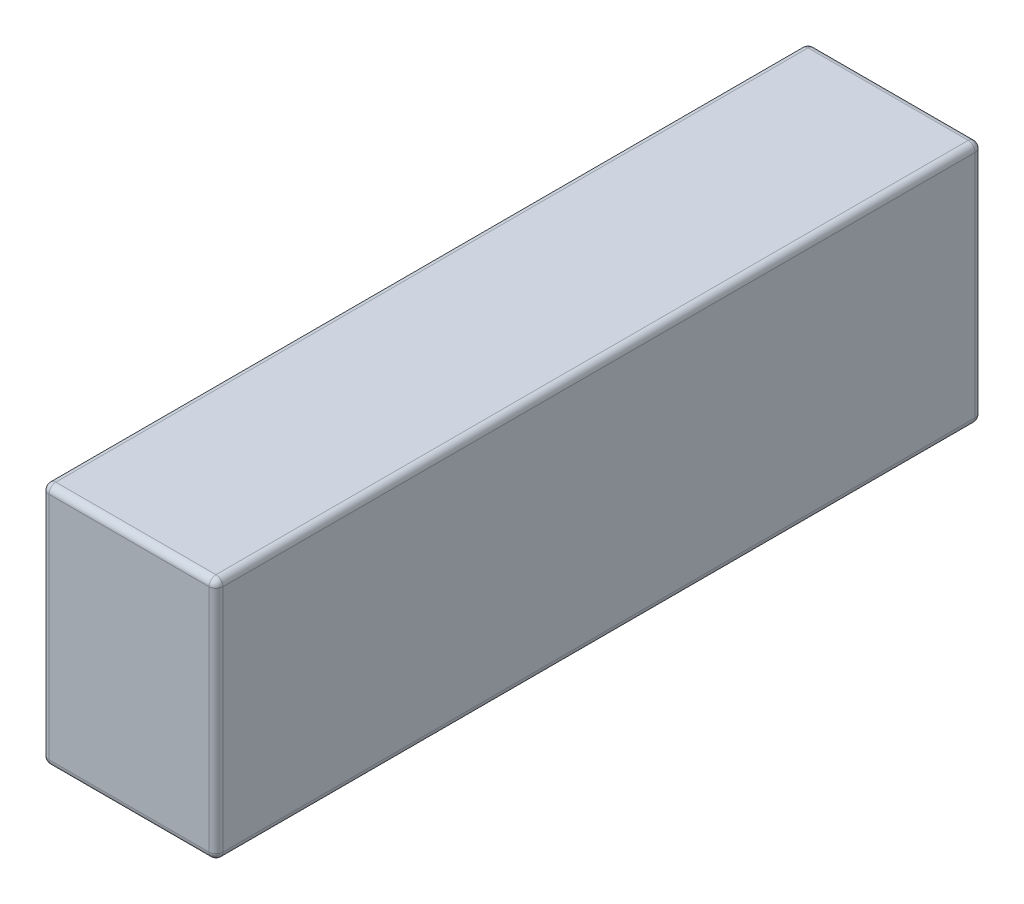
ISO-10303-21;
HEADER;
FILE_DESCRIPTION(('STEP AP214'),'2;1');
FILE_NAME('part.step','',(''),(''),'','','');
FILE_SCHEMA(('AUTOMOTIVE_DESIGN { 1 0 10303 214 1 1 1 1 }'));
ENDSEC;
DATA;
#1=APPLICATION_CONTEXT('core data for automotive mechanical design processes');
#2=APPLICATION_PROTOCOL_DEFINITION('international standard','automotive_design',2000,#1);
#3=PRODUCT_CONTEXT('',#1,'mechanical');
#4=PRODUCT('Part','Part','',(#3));
#5=PRODUCT_RELATED_PRODUCT_CATEGORY('part','',(#4));
#6=PRODUCT_DEFINITION_FORMATION('','',#4);
#7=PRODUCT_DEFINITION_CONTEXT('part definition',#1,'design');
#8=PRODUCT_DEFINITION('design','',#6,#7);
#9=PRODUCT_DEFINITION_SHAPE('','',#8);
#10=(LENGTH_UNIT() NAMED_UNIT(*) SI_UNIT(.MILLI.,.METRE.));
#11=(NAMED_UNIT(*) PLANE_ANGLE_UNIT() SI_UNIT($,.RADIAN.));
#12=(NAMED_UNIT(*) SI_UNIT($,.STERADIAN.) SOLID_ANGLE_UNIT());
#13=UNCERTAINTY_MEASURE_WITH_UNIT(LENGTH_MEASURE(1.E-05),#10,'distance_accuracy_value','');
#14=(GEOMETRIC_REPRESENTATION_CONTEXT(3) GLOBAL_UNCERTAINTY_ASSIGNED_CONTEXT((#13)) GLOBAL_UNIT_ASSIGNED_CONTEXT((#10,
#11,#12)) REPRESENTATION_CONTEXT('',''));
#15=CARTESIAN_POINT('',(0.,0.,0.));
#16=DIRECTION('',(0.,0.,1.));
#17=DIRECTION('',(1.,0.,0.));
#18=AXIS2_PLACEMENT_3D('',#15,#16,#17);
#19=CARTESIAN_POINT('',(-12.5,35.,55.));
#20=DIRECTION('',(1.,0.,0.));
#21=DIRECTION('',(0.,0.,-1.));
#22=AXIS2_PLACEMENT_3D('',#19,#20,#21);
#23=PLANE('',#22);
#24=DIRECTION('',(0.,0.,1.));
#25=VECTOR('',#24,1.);
#26=CARTESIAN_POINT('',(-12.5,34.,-55.));
#27=LINE('',#26,#25);
#28=CARTESIAN_POINT('',(-12.5,34.,54.));
#29=VERTEX_POINT('',#28);
#30=CARTESIAN_POINT('',(-12.5,34.,-54.));
#31=VERTEX_POINT('',#30);
#32=EDGE_CURVE('E174',#29,#31,#27,.F.);
#33=ORIENTED_EDGE('',*,*,#32,.T.);
#34=DIRECTION('',(0.,-1.,0.));
#35=VECTOR('',#34,1.);
#36=CARTESIAN_POINT('',(-12.5,35.,-54.));
#37=LINE('',#36,#35);
#38=CARTESIAN_POINT('',(-12.5,1.,-54.));
#39=VERTEX_POINT('',#38);
#40=EDGE_CURVE('E180',#31,#39,#37,.T.);
#41=ORIENTED_EDGE('',*,*,#40,.T.);
#42=DIRECTION('',(0.,0.,1.));
#43=VECTOR('',#42,1.);
#44=CARTESIAN_POINT('',(-12.5,1.,55.));
#45=LINE('',#44,#43);
#46=CARTESIAN_POINT('',(-12.5,1.,54.));
#47=VERTEX_POINT('',#46);
#48=EDGE_CURVE('E178',#39,#47,#45,.T.);
#49=ORIENTED_EDGE('',*,*,#48,.T.);
#50=DIRECTION('',(0.,-1.,0.));
#51=VECTOR('',#50,1.);
#52=CARTESIAN_POINT('',(-12.5,35.,54.));
#53=LINE('',#52,#51);
#54=EDGE_CURVE('E176',#47,#29,#53,.F.);
#55=ORIENTED_EDGE('',*,*,#54,.T.);
#56=EDGE_LOOP('',(#33,#41,#49,#55));
#57=FACE_BOUND('',#56,.T.);
#58=ADVANCED_FACE('F34',(#57),#23,.F.);
#59=CARTESIAN_POINT('',(12.5,35.,55.));
#60=DIRECTION('',(0.,0.,-1.));
#61=DIRECTION('',(-1.,0.,0.));
#62=AXIS2_PLACEMENT_3D('',#59,#60,#61);
#63=PLANE('',#62);
#64=DIRECTION('',(1.,0.,0.));
#65=VECTOR('',#64,1.);
#66=CARTESIAN_POINT('',(-12.5,34.,55.));
#67=LINE('',#66,#65);
#68=CARTESIAN_POINT('',(11.5,34.,55.));
#69=VERTEX_POINT('',#68);
#70=CARTESIAN_POINT('',(-11.5,34.,55.));
#71=VERTEX_POINT('',#70);
#72=EDGE_CURVE('E185',#69,#71,#67,.F.);
#73=ORIENTED_EDGE('',*,*,#72,.T.);
#74=DIRECTION('',(0.,-1.,0.));
#75=VECTOR('',#74,1.);
#76=CARTESIAN_POINT('',(-11.5,35.,55.));
#77=LINE('',#76,#75);
#78=CARTESIAN_POINT('',(-11.5,1.,55.));
#79=VERTEX_POINT('',#78);
#80=EDGE_CURVE('E189',#71,#79,#77,.T.);
#81=ORIENTED_EDGE('',*,*,#80,.T.);
#82=DIRECTION('',(1.,0.,0.));
#83=VECTOR('',#82,1.);
#84=CARTESIAN_POINT('',(12.5,1.,55.));
#85=LINE('',#84,#83);
#86=CARTESIAN_POINT('',(11.5,1.,55.));
#87=VERTEX_POINT('',#86);
#88=EDGE_CURVE('E187',#79,#87,#85,.T.);
#89=ORIENTED_EDGE('',*,*,#88,.T.);
#90=DIRECTION('',(0.,-1.,0.));
#91=VECTOR('',#90,1.);
#92=CARTESIAN_POINT('',(11.5,35.,55.));
#93=LINE('',#92,#91);
#94=EDGE_CURVE('E183',#87,#69,#93,.F.);
#95=ORIENTED_EDGE('',*,*,#94,.T.);
#96=EDGE_LOOP('',(#73,#81,#89,#95));
#97=FACE_BOUND('',#96,.T.);
#98=ADVANCED_FACE('F273',(#97),#63,.F.);
#99=CARTESIAN_POINT('',(12.5,35.,55.));
#100=DIRECTION('',(-1.,0.,0.));
#101=DIRECTION('',(0.,0.,1.));
#102=AXIS2_PLACEMENT_3D('',#99,#100,#101);
#103=PLANE('',#102);
#104=DIRECTION('',(0.,0.,-1.));
#105=VECTOR('',#104,1.);
#106=CARTESIAN_POINT('',(12.5,34.,55.));
#107=LINE('',#106,#105);
#108=CARTESIAN_POINT('',(12.5,34.,-54.));
#109=VERTEX_POINT('',#108);
#110=CARTESIAN_POINT('',(12.5,34.,54.));
#111=VERTEX_POINT('',#110);
#112=EDGE_CURVE('E43',#109,#111,#107,.F.);
#113=ORIENTED_EDGE('',*,*,#112,.T.);
#114=DIRECTION('',(0.,-1.,0.));
#115=VECTOR('',#114,1.);
#116=CARTESIAN_POINT('',(12.5,35.,54.));
#117=LINE('',#116,#115);
#118=CARTESIAN_POINT('',(12.5,1.,54.));
#119=VERTEX_POINT('',#118);
#120=EDGE_CURVE('E11',#111,#119,#117,.T.);
#121=ORIENTED_EDGE('',*,*,#120,.T.);
#122=DIRECTION('',(0.,0.,-1.));
#123=VECTOR('',#122,1.);
#124=CARTESIAN_POINT('',(12.5,1.,55.));
#125=LINE('',#124,#123);
#126=CARTESIAN_POINT('',(12.5,1.,-54.));
#127=VERTEX_POINT('',#126);
#128=EDGE_CURVE('E199',#119,#127,#125,.T.);
#129=ORIENTED_EDGE('',*,*,#128,.T.);
#130=DIRECTION('',(0.,-1.,0.));
#131=VECTOR('',#130,1.);
#132=CARTESIAN_POINT('',(12.5,35.,-54.));
#133=LINE('',#132,#131);
#134=EDGE_CURVE('E54',#127,#109,#133,.F.);
#135=ORIENTED_EDGE('',*,*,#134,.T.);
#136=EDGE_LOOP('',(#113,#121,#129,#135));
#137=FACE_BOUND('',#136,.T.);
#138=ADVANCED_FACE('F286',(#137),#103,.F.);
#139=CARTESIAN_POINT('',(12.5,35.,-55.));
#140=DIRECTION('',(0.,0.,1.));
#141=DIRECTION('',(1.,0.,0.));
#142=AXIS2_PLACEMENT_3D('',#139,#140,#141);
#143=PLANE('',#142);
#144=DIRECTION('',(0.,-1.,0.));
#145=VECTOR('',#144,1.);
#146=CARTESIAN_POINT('',(11.5,35.,-55.));
#147=LINE('',#146,#145);
#148=CARTESIAN_POINT('',(11.5,34.,-55.));
#149=VERTEX_POINT('',#148);
#150=CARTESIAN_POINT('',(11.5,1.,-55.));
#151=VERTEX_POINT('',#150);
#152=EDGE_CURVE('E126',#149,#151,#147,.T.);
#153=ORIENTED_EDGE('',*,*,#152,.T.);
#154=DIRECTION('',(-1.,0.,0.));
#155=VECTOR('',#154,1.);
#156=CARTESIAN_POINT('',(12.5,1.,-55.));
#157=LINE('',#156,#155);
#158=CARTESIAN_POINT('',(-11.5,1.,-55.));
#159=VERTEX_POINT('',#158);
#160=EDGE_CURVE('E163',#151,#159,#157,.T.);
#161=ORIENTED_EDGE('',*,*,#160,.T.);
#162=DIRECTION('',(0.,-1.,0.));
#163=VECTOR('',#162,1.);
#164=CARTESIAN_POINT('',(-11.5,35.,-55.));
#165=LINE('',#164,#163);
#166=CARTESIAN_POINT('',(-11.5,34.,-55.));
#167=VERTEX_POINT('',#166);
#168=EDGE_CURVE('E129',#159,#167,#165,.F.);
#169=ORIENTED_EDGE('',*,*,#168,.T.);
#170=DIRECTION('',(-1.,0.,0.));
#171=VECTOR('',#170,1.);
#172=CARTESIAN_POINT('',(12.5,34.,-55.));
#173=LINE('',#172,#171);
#174=EDGE_CURVE('E121',#167,#149,#173,.F.);
#175=ORIENTED_EDGE('',*,*,#174,.T.);
#176=EDGE_LOOP('',(#153,#161,#169,#175));
#177=FACE_BOUND('',#176,.T.);
#178=ADVANCED_FACE('F123',(#177),#143,.F.);
#179=CARTESIAN_POINT('',(0.,35.,0.));
#180=DIRECTION('',(0.,1.,0.));
#181=DIRECTION('',(0.,0.,1.));
#182=AXIS2_PLACEMENT_3D('',#179,#180,#181);
#183=PLANE('',#182);
#184=DIRECTION('',(-1.,0.,0.));
#185=VECTOR('',#184,1.);
#186=CARTESIAN_POINT('',(-12.5,35.,-54.));
#187=LINE('',#186,#185);
#188=CARTESIAN_POINT('',(11.5,35.,-54.));
#189=VERTEX_POINT('',#188);
#190=CARTESIAN_POINT('',(-11.5,35.,-54.));
#191=VERTEX_POINT('',#190);
#192=EDGE_CURVE('E140',#189,#191,#187,.T.);
#193=ORIENTED_EDGE('',*,*,#192,.T.);
#194=DIRECTION('',(0.,0.,1.));
#195=VECTOR('',#194,1.);
#196=CARTESIAN_POINT('',(-11.5,35.,55.));
#197=LINE('',#196,#195);
#198=CARTESIAN_POINT('',(-11.5,35.,54.));
#199=VERTEX_POINT('',#198);
#200=EDGE_CURVE('E197',#191,#199,#197,.T.);
#201=ORIENTED_EDGE('',*,*,#200,.T.);
#202=DIRECTION('',(1.,0.,0.));
#203=VECTOR('',#202,1.);
#204=CARTESIAN_POINT('',(12.5,35.,54.));
#205=LINE('',#204,#203);
#206=CARTESIAN_POINT('',(11.5,35.,54.));
#207=VERTEX_POINT('',#206);
#208=EDGE_CURVE('E194',#199,#207,#205,.T.);
#209=ORIENTED_EDGE('',*,*,#208,.T.);
#210=DIRECTION('',(0.,0.,-1.));
#211=VECTOR('',#210,1.);
#212=CARTESIAN_POINT('',(11.5,35.,-55.));
#213=LINE('',#212,#211);
#214=EDGE_CURVE('E192',#207,#189,#213,.T.);
#215=ORIENTED_EDGE('',*,*,#214,.T.);
#216=EDGE_LOOP('',(#193,#201,#209,#215));
#217=FACE_BOUND('',#216,.T.);
#218=ADVANCED_FACE('F478',(#217),#183,.T.);
#219=CARTESIAN_POINT('',(0.,0.,0.));
#220=DIRECTION('',(0.,1.,0.));
#221=DIRECTION('',(0.,0.,1.));
#222=AXIS2_PLACEMENT_3D('',#219,#220,#221);
#223=PLANE('',#222);
#224=DIRECTION('',(0.,0.,1.));
#225=VECTOR('',#224,1.);
#226=CARTESIAN_POINT('',(-11.5,0.,0.));
#227=LINE('',#226,#225);
#228=CARTESIAN_POINT('',(-11.5,0.,54.));
#229=VERTEX_POINT('',#228);
#230=CARTESIAN_POINT('',(-11.5,0.,-54.));
#231=VERTEX_POINT('',#230);
#232=EDGE_CURVE('E169',#229,#231,#227,.F.);
#233=ORIENTED_EDGE('',*,*,#232,.T.);
#234=DIRECTION('',(-1.,0.,0.));
#235=VECTOR('',#234,1.);
#236=CARTESIAN_POINT('',(0.,0.,-54.));
#237=LINE('',#236,#235);
#238=CARTESIAN_POINT('',(11.5,0.,-54.));
#239=VERTEX_POINT('',#238);
#240=EDGE_CURVE('E171',#231,#239,#237,.F.);
#241=ORIENTED_EDGE('',*,*,#240,.T.);
#242=DIRECTION('',(0.,0.,-1.));
#243=VECTOR('',#242,1.);
#244=CARTESIAN_POINT('',(11.5,0.,0.));
#245=LINE('',#244,#243);
#246=CARTESIAN_POINT('',(11.5,0.,54.));
#247=VERTEX_POINT('',#246);
#248=EDGE_CURVE('E165',#239,#247,#245,.F.);
#249=ORIENTED_EDGE('',*,*,#248,.T.);
#250=DIRECTION('',(1.,0.,0.));
#251=VECTOR('',#250,1.);
#252=CARTESIAN_POINT('',(0.,0.,54.));
#253=LINE('',#252,#251);
#254=EDGE_CURVE('E167',#247,#229,#253,.F.);
#255=ORIENTED_EDGE('',*,*,#254,.T.);
#256=EDGE_LOOP('',(#233,#241,#249,#255));
#257=FACE_BOUND('',#256,.T.);
#258=ADVANCED_FACE('F471',(#257),#223,.F.);
#259=CARTESIAN_POINT('',(0.,34.,54.));
#260=DIRECTION('',(-1.,0.,0.));
#261=DIRECTION('',(0.,0.,1.));
#262=AXIS2_PLACEMENT_3D('',#259,#260,#261);
#263=CYLINDRICAL_SURFACE('',#262,1.);
#264=CARTESIAN_POINT('',(11.5,34.,54.));
#265=DIRECTION('',(1.,0.,0.));
#266=DIRECTION('',(0.,0.,-1.));
#267=AXIS2_PLACEMENT_3D('',#264,#265,#266);
#268=CIRCLE('',#267,1.);
#269=EDGE_CURVE('E38',#207,#69,#268,.T.);
#270=ORIENTED_EDGE('',*,*,#269,.F.);
#271=ORIENTED_EDGE('',*,*,#208,.F.);
#272=CARTESIAN_POINT('',(-11.5,34.,54.));
#273=DIRECTION('',(-1.,0.,0.));
#274=DIRECTION('',(0.,0.,1.));
#275=AXIS2_PLACEMENT_3D('',#272,#273,#274);
#276=CIRCLE('',#275,1.);
#277=EDGE_CURVE('E160',#71,#199,#276,.T.);
#278=ORIENTED_EDGE('',*,*,#277,.F.);
#279=ORIENTED_EDGE('',*,*,#72,.F.);
#280=EDGE_LOOP('',(#270,#271,#278,#279));
#281=FACE_BOUND('',#280,.T.);
#282=ADVANCED_FACE('F36',(#281),#263,.T.);
#283=CARTESIAN_POINT('',(11.5,34.,54.));
#284=DIRECTION('',(0.,0.,1.));
#285=DIRECTION('',(1.,0.,0.));
#286=AXIS2_PLACEMENT_3D('',#283,#284,#285);
#287=SPHERICAL_SURFACE('',#286,1.);
#288=CARTESIAN_POINT('',(11.5,34.,54.));
#289=DIRECTION('',(0.,0.,1.));
#290=DIRECTION('',(1.,0.,0.));
#291=AXIS2_PLACEMENT_3D('',#288,#289,#290);
#292=CIRCLE('',#291,1.);
#293=EDGE_CURVE('E244',#207,#111,#292,.F.);
#294=ORIENTED_EDGE('',*,*,#293,.F.);
#295=ORIENTED_EDGE('',*,*,#269,.T.);
#296=CARTESIAN_POINT('',(11.5,34.,54.));
#297=DIRECTION('',(0.,1.,0.));
#298=DIRECTION('',(0.,0.,1.));
#299=AXIS2_PLACEMENT_3D('',#296,#297,#298);
#300=CIRCLE('',#299,1.);
#301=EDGE_CURVE('E246',#111,#69,#300,.F.);
#302=ORIENTED_EDGE('',*,*,#301,.F.);
#303=EDGE_LOOP('',(#294,#295,#302));
#304=FACE_BOUND('',#303,.T.);
#305=ADVANCED_FACE('F279',(#304),#287,.T.);
#306=CARTESIAN_POINT('',(-11.5,34.,54.));
#307=DIRECTION('',(0.,0.,1.));
#308=DIRECTION('',(1.,0.,0.));
#309=AXIS2_PLACEMENT_3D('',#306,#307,#308);
#310=SPHERICAL_SURFACE('',#309,1.);
#311=CARTESIAN_POINT('',(-11.5,34.,54.));
#312=DIRECTION('',(0.,1.,0.));
#313=DIRECTION('',(0.,0.,1.));
#314=AXIS2_PLACEMENT_3D('',#311,#312,#313);
#315=CIRCLE('',#314,1.);
#316=EDGE_CURVE('E238',#71,#29,#315,.F.);
#317=ORIENTED_EDGE('',*,*,#316,.F.);
#318=ORIENTED_EDGE('',*,*,#277,.T.);
#319=CARTESIAN_POINT('',(-11.5,34.,54.));
#320=DIRECTION('',(0.,0.,1.));
#321=DIRECTION('',(1.,0.,0.));
#322=AXIS2_PLACEMENT_3D('',#319,#320,#321);
#323=CIRCLE('',#322,1.);
#324=EDGE_CURVE('E241',#29,#199,#323,.F.);
#325=ORIENTED_EDGE('',*,*,#324,.F.);
#326=EDGE_LOOP('',(#317,#318,#325));
#327=FACE_BOUND('',#326,.T.);
#328=ADVANCED_FACE('F253',(#327),#310,.T.);
#329=CARTESIAN_POINT('',(11.5,35.,54.));
#330=DIRECTION('',(0.,-1.,0.));
#331=DIRECTION('',(0.,0.,-1.));
#332=AXIS2_PLACEMENT_3D('',#329,#330,#331);
#333=CYLINDRICAL_SURFACE('',#332,1.);
#334=ORIENTED_EDGE('',*,*,#301,.T.);
#335=ORIENTED_EDGE('',*,*,#94,.F.);
#336=CARTESIAN_POINT('',(11.5,1.,54.));
#337=DIRECTION('',(0.,-1.,0.));
#338=DIRECTION('',(0.,0.,-1.));
#339=AXIS2_PLACEMENT_3D('',#336,#337,#338);
#340=CIRCLE('',#339,1.);
#341=EDGE_CURVE('E232',#119,#87,#340,.T.);
#342=ORIENTED_EDGE('',*,*,#341,.F.);
#343=ORIENTED_EDGE('',*,*,#120,.F.);
#344=EDGE_LOOP('',(#334,#335,#342,#343));
#345=FACE_BOUND('',#344,.T.);
#346=ADVANCED_FACE('F283',(#345),#333,.T.);
#347=CARTESIAN_POINT('',(11.5,34.,0.));
#348=DIRECTION('',(0.,0.,1.));
#349=DIRECTION('',(1.,0.,0.));
#350=AXIS2_PLACEMENT_3D('',#347,#348,#349);
#351=CYLINDRICAL_SURFACE('',#350,1.);
#352=ORIENTED_EDGE('',*,*,#293,.T.);
#353=ORIENTED_EDGE('',*,*,#112,.F.);
#354=CARTESIAN_POINT('',(11.5,34.,-54.));
#355=DIRECTION('',(0.,0.,-1.));
#356=DIRECTION('',(-1.,0.,0.));
#357=AXIS2_PLACEMENT_3D('',#354,#355,#356);
#358=CIRCLE('',#357,1.);
#359=EDGE_CURVE('E144',#189,#109,#358,.T.);
#360=ORIENTED_EDGE('',*,*,#359,.F.);
#361=ORIENTED_EDGE('',*,*,#214,.F.);
#362=EDGE_LOOP('',(#352,#353,#360,#361));
#363=FACE_BOUND('',#362,.T.);
#364=ADVANCED_FACE('F435',(#363),#351,.T.);
#365=CARTESIAN_POINT('',(0.,34.,-54.));
#366=DIRECTION('',(1.,0.,0.));
#367=DIRECTION('',(0.,0.,-1.));
#368=AXIS2_PLACEMENT_3D('',#365,#366,#367);
#369=CYLINDRICAL_SURFACE('',#368,1.);
#370=CARTESIAN_POINT('',(-11.5,34.,-54.));
#371=DIRECTION('',(-1.,0.,0.));
#372=DIRECTION('',(0.,0.,1.));
#373=AXIS2_PLACEMENT_3D('',#370,#371,#372);
#374=CIRCLE('',#373,1.);
#375=EDGE_CURVE('E145',#191,#167,#374,.T.);
#376=ORIENTED_EDGE('',*,*,#375,.F.);
#377=ORIENTED_EDGE('',*,*,#192,.F.);
#378=CARTESIAN_POINT('',(11.5,34.,-54.));
#379=DIRECTION('',(1.,0.,0.));
#380=DIRECTION('',(0.,0.,-1.));
#381=AXIS2_PLACEMENT_3D('',#378,#379,#380);
#382=CIRCLE('',#381,1.);
#383=EDGE_CURVE('E136',#149,#189,#382,.T.);
#384=ORIENTED_EDGE('',*,*,#383,.F.);
#385=ORIENTED_EDGE('',*,*,#174,.F.);
#386=EDGE_LOOP('',(#376,#377,#384,#385));
#387=FACE_BOUND('',#386,.T.);
#388=ADVANCED_FACE('F138',(#387),#369,.T.);
#389=CARTESIAN_POINT('',(-11.5,34.,0.));
#390=DIRECTION('',(0.,0.,-1.));
#391=DIRECTION('',(-1.,0.,0.));
#392=AXIS2_PLACEMENT_3D('',#389,#390,#391);
#393=CYLINDRICAL_SURFACE('',#392,1.);
#394=ORIENTED_EDGE('',*,*,#324,.T.);
#395=ORIENTED_EDGE('',*,*,#200,.F.);
#396=CARTESIAN_POINT('',(-11.5,34.,-54.));
#397=DIRECTION('',(0.,0.,-1.));
#398=DIRECTION('',(-1.,0.,0.));
#399=AXIS2_PLACEMENT_3D('',#396,#397,#398);
#400=CIRCLE('',#399,1.);
#401=EDGE_CURVE('E228',#31,#191,#400,.T.);
#402=ORIENTED_EDGE('',*,*,#401,.F.);
#403=ORIENTED_EDGE('',*,*,#32,.F.);
#404=EDGE_LOOP('',(#394,#395,#402,#403));
#405=FACE_BOUND('',#404,.T.);
#406=ADVANCED_FACE('F261',(#405),#393,.T.);
#407=CARTESIAN_POINT('',(-11.5,35.,54.));
#408=DIRECTION('',(0.,-1.,0.));
#409=DIRECTION('',(0.,0.,-1.));
#410=AXIS2_PLACEMENT_3D('',#407,#408,#409);
#411=CYLINDRICAL_SURFACE('',#410,1.);
#412=ORIENTED_EDGE('',*,*,#316,.T.);
#413=ORIENTED_EDGE('',*,*,#54,.F.);
#414=CARTESIAN_POINT('',(-11.5,1.,54.));
#415=DIRECTION('',(0.,-1.,0.));
#416=DIRECTION('',(0.,0.,-1.));
#417=AXIS2_PLACEMENT_3D('',#414,#415,#416);
#418=CIRCLE('',#417,1.);
#419=EDGE_CURVE('E225',#79,#47,#418,.T.);
#420=ORIENTED_EDGE('',*,*,#419,.F.);
#421=ORIENTED_EDGE('',*,*,#80,.F.);
#422=EDGE_LOOP('',(#412,#413,#420,#421));
#423=FACE_BOUND('',#422,.T.);
#424=ADVANCED_FACE('F270',(#423),#411,.T.);
#425=CARTESIAN_POINT('',(12.5,1.,54.));
#426=DIRECTION('',(1.,0.,0.));
#427=DIRECTION('',(0.,0.,-1.));
#428=AXIS2_PLACEMENT_3D('',#425,#426,#427);
#429=CYLINDRICAL_SURFACE('',#428,1.);
#430=CARTESIAN_POINT('',(11.5,1.,54.));
#431=DIRECTION('',(1.,0.,0.));
#432=DIRECTION('',(0.,0.,-1.));
#433=AXIS2_PLACEMENT_3D('',#430,#431,#432);
#434=CIRCLE('',#433,1.);
#435=EDGE_CURVE('E235',#87,#247,#434,.T.);
#436=ORIENTED_EDGE('',*,*,#435,.F.);
#437=ORIENTED_EDGE('',*,*,#88,.F.);
#438=CARTESIAN_POINT('',(-11.5,1.,54.));
#439=DIRECTION('',(-1.,0.,0.));
#440=DIRECTION('',(0.,0.,1.));
#441=AXIS2_PLACEMENT_3D('',#438,#439,#440);
#442=CIRCLE('',#441,1.);
#443=EDGE_CURVE('E223',#229,#79,#442,.T.);
#444=ORIENTED_EDGE('',*,*,#443,.F.);
#445=ORIENTED_EDGE('',*,*,#254,.F.);
#446=EDGE_LOOP('',(#436,#437,#444,#445));
#447=FACE_BOUND('',#446,.T.);
#448=ADVANCED_FACE('F404',(#447),#429,.T.);
#449=CARTESIAN_POINT('',(11.5,1.,54.));
#450=DIRECTION('',(0.,0.,1.));
#451=DIRECTION('',(1.,0.,0.));
#452=AXIS2_PLACEMENT_3D('',#449,#450,#451);
#453=SPHERICAL_SURFACE('',#452,1.);
#454=ORIENTED_EDGE('',*,*,#341,.T.);
#455=ORIENTED_EDGE('',*,*,#435,.T.);
#456=CARTESIAN_POINT('',(11.5,1.,54.));
#457=DIRECTION('',(0.,0.,1.));
#458=DIRECTION('',(1.,0.,0.));
#459=AXIS2_PLACEMENT_3D('',#456,#457,#458);
#460=CIRCLE('',#459,1.);
#461=EDGE_CURVE('E151',#119,#247,#460,.F.);
#462=ORIENTED_EDGE('',*,*,#461,.F.);
#463=EDGE_LOOP('',(#454,#455,#462));
#464=FACE_BOUND('',#463,.T.);
#465=ADVANCED_FACE('F316',(#464),#453,.T.);
#466=CARTESIAN_POINT('',(11.5,34.,-54.));
#467=DIRECTION('',(0.,0.,1.));
#468=DIRECTION('',(1.,0.,0.));
#469=AXIS2_PLACEMENT_3D('',#466,#467,#468);
#470=SPHERICAL_SURFACE('',#469,1.);
#471=ORIENTED_EDGE('',*,*,#383,.T.);
#472=ORIENTED_EDGE('',*,*,#359,.T.);
#473=CARTESIAN_POINT('',(11.5,34.,-54.));
#474=DIRECTION('',(0.,1.,0.));
#475=DIRECTION('',(0.,0.,1.));
#476=AXIS2_PLACEMENT_3D('',#473,#474,#475);
#477=CIRCLE('',#476,1.);
#478=EDGE_CURVE('E148',#149,#109,#477,.F.);
#479=ORIENTED_EDGE('',*,*,#478,.F.);
#480=EDGE_LOOP('',(#471,#472,#479));
#481=FACE_BOUND('',#480,.T.);
#482=ADVANCED_FACE('F149',(#481),#470,.T.);
#483=CARTESIAN_POINT('',(-11.5,34.,-54.));
#484=DIRECTION('',(0.,0.,1.));
#485=DIRECTION('',(1.,0.,0.));
#486=AXIS2_PLACEMENT_3D('',#483,#484,#485);
#487=SPHERICAL_SURFACE('',#486,1.);
#488=ORIENTED_EDGE('',*,*,#401,.T.);
#489=ORIENTED_EDGE('',*,*,#375,.T.);
#490=CARTESIAN_POINT('',(-11.5,34.,-54.));
#491=DIRECTION('',(0.,1.,0.));
#492=DIRECTION('',(0.,0.,1.));
#493=AXIS2_PLACEMENT_3D('',#490,#491,#492);
#494=CIRCLE('',#493,1.);
#495=EDGE_CURVE('E152',#31,#167,#494,.F.);
#496=ORIENTED_EDGE('',*,*,#495,.F.);
#497=EDGE_LOOP('',(#488,#489,#496));
#498=FACE_BOUND('',#497,.T.);
#499=ADVANCED_FACE('F306',(#498),#487,.T.);
#500=CARTESIAN_POINT('',(-11.5,1.,54.));
#501=DIRECTION('',(0.,0.,1.));
#502=DIRECTION('',(1.,0.,0.));
#503=AXIS2_PLACEMENT_3D('',#500,#501,#502);
#504=SPHERICAL_SURFACE('',#503,1.);
#505=ORIENTED_EDGE('',*,*,#443,.T.);
#506=ORIENTED_EDGE('',*,*,#419,.T.);
#507=CARTESIAN_POINT('',(-11.5,1.,54.));
#508=DIRECTION('',(0.,0.,1.));
#509=DIRECTION('',(1.,0.,0.));
#510=AXIS2_PLACEMENT_3D('',#507,#508,#509);
#511=CIRCLE('',#510,1.);
#512=EDGE_CURVE('E216',#229,#47,#511,.F.);
#513=ORIENTED_EDGE('',*,*,#512,.F.);
#514=EDGE_LOOP('',(#505,#506,#513));
#515=FACE_BOUND('',#514,.T.);
#516=ADVANCED_FACE('F308',(#515),#504,.T.);
#517=CARTESIAN_POINT('',(11.5,1.,55.));
#518=DIRECTION('',(0.,0.,-1.));
#519=DIRECTION('',(-1.,0.,0.));
#520=AXIS2_PLACEMENT_3D('',#517,#518,#519);
#521=CYLINDRICAL_SURFACE('',#520,1.);
#522=ORIENTED_EDGE('',*,*,#461,.T.);
#523=ORIENTED_EDGE('',*,*,#248,.F.);
#524=CARTESIAN_POINT('',(11.5,1.,-54.));
#525=DIRECTION('',(0.,0.,-1.));
#526=DIRECTION('',(-1.,0.,0.));
#527=AXIS2_PLACEMENT_3D('',#524,#525,#526);
#528=CIRCLE('',#527,1.);
#529=EDGE_CURVE('E213',#127,#239,#528,.T.);
#530=ORIENTED_EDGE('',*,*,#529,.F.);
#531=ORIENTED_EDGE('',*,*,#128,.F.);
#532=EDGE_LOOP('',(#522,#523,#530,#531));
#533=FACE_BOUND('',#532,.T.);
#534=ADVANCED_FACE('F291',(#533),#521,.T.);
#535=CARTESIAN_POINT('',(11.5,35.,-54.));
#536=DIRECTION('',(0.,-1.,0.));
#537=DIRECTION('',(0.,0.,-1.));
#538=AXIS2_PLACEMENT_3D('',#535,#536,#537);
#539=CYLINDRICAL_SURFACE('',#538,1.);
#540=ORIENTED_EDGE('',*,*,#478,.T.);
#541=ORIENTED_EDGE('',*,*,#134,.F.);
#542=CARTESIAN_POINT('',(11.5,1.,-54.));
#543=DIRECTION('',(0.,-1.,0.));
#544=DIRECTION('',(0.,0.,-1.));
#545=AXIS2_PLACEMENT_3D('',#542,#543,#544);
#546=CIRCLE('',#545,1.);
#547=EDGE_CURVE('E156',#151,#127,#546,.T.);
#548=ORIENTED_EDGE('',*,*,#547,.F.);
#549=ORIENTED_EDGE('',*,*,#152,.F.);
#550=EDGE_LOOP('',(#540,#541,#548,#549));
#551=FACE_BOUND('',#550,.T.);
#552=ADVANCED_FACE('F154',(#551),#539,.T.);
#553=CARTESIAN_POINT('',(-11.5,35.,-54.));
#554=DIRECTION('',(0.,-1.,0.));
#555=DIRECTION('',(0.,0.,-1.));
#556=AXIS2_PLACEMENT_3D('',#553,#554,#555);
#557=CYLINDRICAL_SURFACE('',#556,1.);
#558=ORIENTED_EDGE('',*,*,#495,.T.);
#559=ORIENTED_EDGE('',*,*,#168,.F.);
#560=CARTESIAN_POINT('',(-11.5,1.,-54.));
#561=DIRECTION('',(0.,-1.,0.));
#562=DIRECTION('',(0.,0.,-1.));
#563=AXIS2_PLACEMENT_3D('',#560,#561,#562);
#564=CIRCLE('',#563,1.);
#565=EDGE_CURVE('E209',#39,#159,#564,.T.);
#566=ORIENTED_EDGE('',*,*,#565,.F.);
#567=ORIENTED_EDGE('',*,*,#40,.F.);
#568=EDGE_LOOP('',(#558,#559,#566,#567));
#569=FACE_BOUND('',#568,.T.);
#570=ADVANCED_FACE('F304',(#569),#557,.T.);
#571=CARTESIAN_POINT('',(-11.5,1.,55.));
#572=DIRECTION('',(0.,0.,1.));
#573=DIRECTION('',(1.,0.,0.));
#574=AXIS2_PLACEMENT_3D('',#571,#572,#573);
#575=CYLINDRICAL_SURFACE('',#574,1.);
#576=ORIENTED_EDGE('',*,*,#512,.T.);
#577=ORIENTED_EDGE('',*,*,#48,.F.);
#578=CARTESIAN_POINT('',(-11.5,1.,-54.));
#579=DIRECTION('',(0.,0.,-1.));
#580=DIRECTION('',(-1.,0.,0.));
#581=AXIS2_PLACEMENT_3D('',#578,#579,#580);
#582=CIRCLE('',#581,1.);
#583=EDGE_CURVE('E207',#231,#39,#582,.T.);
#584=ORIENTED_EDGE('',*,*,#583,.F.);
#585=ORIENTED_EDGE('',*,*,#232,.F.);
#586=EDGE_LOOP('',(#576,#577,#584,#585));
#587=FACE_BOUND('',#586,.T.);
#588=ADVANCED_FACE('F332',(#587),#575,.T.);
#589=CARTESIAN_POINT('',(11.5,1.,-54.));
#590=DIRECTION('',(0.,0.,1.));
#591=DIRECTION('',(1.,0.,0.));
#592=AXIS2_PLACEMENT_3D('',#589,#590,#591);
#593=SPHERICAL_SURFACE('',#592,1.);
#594=ORIENTED_EDGE('',*,*,#547,.T.);
#595=ORIENTED_EDGE('',*,*,#529,.T.);
#596=CARTESIAN_POINT('',(11.5,1.,-54.));
#597=DIRECTION('',(1.,0.,0.));
#598=DIRECTION('',(0.,0.,-1.));
#599=AXIS2_PLACEMENT_3D('',#596,#597,#598);
#600=CIRCLE('',#599,1.);
#601=EDGE_CURVE('E205',#151,#239,#600,.F.);
#602=ORIENTED_EDGE('',*,*,#601,.F.);
#603=EDGE_LOOP('',(#594,#595,#602));
#604=FACE_BOUND('',#603,.T.);
#605=ADVANCED_FACE('F293',(#604),#593,.T.);
#606=CARTESIAN_POINT('',(-11.5,1.,-54.));
#607=DIRECTION('',(0.,0.,1.));
#608=DIRECTION('',(1.,0.,0.));
#609=AXIS2_PLACEMENT_3D('',#606,#607,#608);
#610=SPHERICAL_SURFACE('',#609,1.);
#611=ORIENTED_EDGE('',*,*,#583,.T.);
#612=ORIENTED_EDGE('',*,*,#565,.T.);
#613=CARTESIAN_POINT('',(-11.5,1.,-54.));
#614=DIRECTION('',(-1.,0.,0.));
#615=DIRECTION('',(0.,0.,1.));
#616=AXIS2_PLACEMENT_3D('',#613,#614,#615);
#617=CIRCLE('',#616,1.);
#618=EDGE_CURVE('E203',#231,#159,#617,.F.);
#619=ORIENTED_EDGE('',*,*,#618,.F.);
#620=EDGE_LOOP('',(#611,#612,#619));
#621=FACE_BOUND('',#620,.T.);
#622=ADVANCED_FACE('F301',(#621),#610,.T.);
#623=CARTESIAN_POINT('',(12.5,1.,-54.));
#624=DIRECTION('',(-1.,0.,0.));
#625=DIRECTION('',(0.,0.,1.));
#626=AXIS2_PLACEMENT_3D('',#623,#624,#625);
#627=CYLINDRICAL_SURFACE('',#626,1.);
#628=ORIENTED_EDGE('',*,*,#601,.T.);
#629=ORIENTED_EDGE('',*,*,#240,.F.);
#630=ORIENTED_EDGE('',*,*,#618,.T.);
#631=ORIENTED_EDGE('',*,*,#160,.F.);
#632=EDGE_LOOP('',(#628,#629,#630,#631));
#633=FACE_BOUND('',#632,.T.);
#634=ADVANCED_FACE('F297',(#633),#627,.T.);
#635=CLOSED_SHELL('',(#58,#98,#138,#178,#218,#258,#282,#305,#328,#346,#364,#388,#406,#424,#448,
#465,#482,#499,#516,#534,#552,#570,#588,#605,#622,#634));
#636=MANIFOLD_SOLID_BREP('B2',#635);
#637=ADVANCED_BREP_SHAPE_REPRESENTATION('',(#18,#636),#14);
#638=SHAPE_DEFINITION_REPRESENTATION(#9,#637);
ENDSEC;
END-ISO-10303-21;
